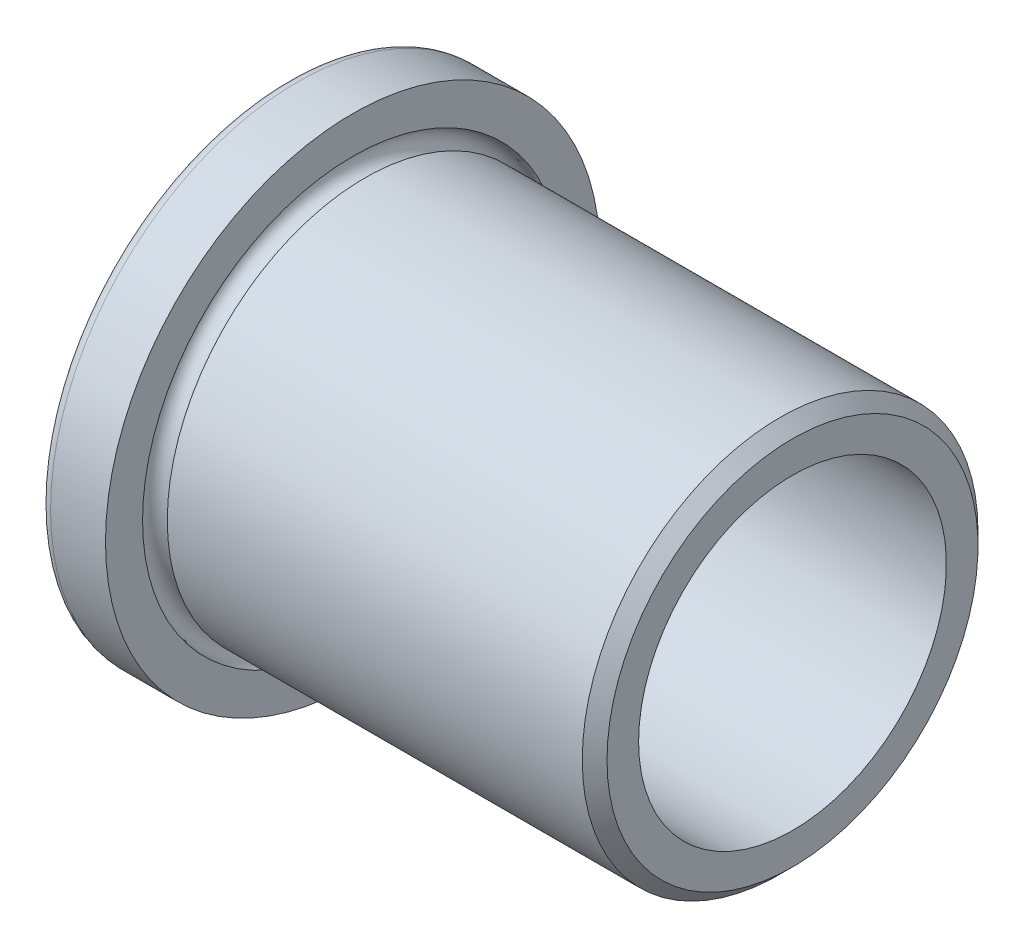
ISO-10303-21;
HEADER;
FILE_DESCRIPTION(('STEP AP214'),'2;1');
FILE_NAME('part.step','',(''),(''),'','','');
FILE_SCHEMA(('AUTOMOTIVE_DESIGN { 1 0 10303 214 1 1 1 1 }'));
ENDSEC;
DATA;
#1=APPLICATION_CONTEXT('core data for automotive mechanical design processes');
#2=APPLICATION_PROTOCOL_DEFINITION('international standard','automotive_design',2000,#1);
#3=PRODUCT_CONTEXT('',#1,'mechanical');
#4=PRODUCT('Part','Part','',(#3));
#5=PRODUCT_RELATED_PRODUCT_CATEGORY('part','',(#4));
#6=PRODUCT_DEFINITION_FORMATION('','',#4);
#7=PRODUCT_DEFINITION_CONTEXT('part definition',#1,'design');
#8=PRODUCT_DEFINITION('design','',#6,#7);
#9=PRODUCT_DEFINITION_SHAPE('','',#8);
#10=(LENGTH_UNIT() NAMED_UNIT(*) SI_UNIT(.MILLI.,.METRE.));
#11=(NAMED_UNIT(*) PLANE_ANGLE_UNIT() SI_UNIT($,.RADIAN.));
#12=(NAMED_UNIT(*) SI_UNIT($,.STERADIAN.) SOLID_ANGLE_UNIT());
#13=UNCERTAINTY_MEASURE_WITH_UNIT(LENGTH_MEASURE(1.E-05),#10,'distance_accuracy_value','');
#14=(GEOMETRIC_REPRESENTATION_CONTEXT(3) GLOBAL_UNCERTAINTY_ASSIGNED_CONTEXT((#13)) GLOBAL_UNIT_ASSIGNED_CONTEXT((#10,
#11,#12)) REPRESENTATION_CONTEXT('',''));
#15=CARTESIAN_POINT('',(0.,0.,0.));
#16=DIRECTION('',(0.,0.,1.));
#17=DIRECTION('',(1.,0.,0.));
#18=AXIS2_PLACEMENT_3D('',#15,#16,#17);
#19=CARTESIAN_POINT('',(9.525,35.7124,0.));
#20=DIRECTION('',(1.,0.,0.));
#21=DIRECTION('',(0.,0.,-1.));
#22=AXIS2_PLACEMENT_3D('',#19,#20,#21);
#23=PLANE('',#22);
#24=CARTESIAN_POINT('',(9.525,0.,0.));
#25=DIRECTION('',(-1.,0.,0.));
#26=DIRECTION('',(0.,0.,1.));
#27=AXIS2_PLACEMENT_3D('',#24,#25,#26);
#28=CIRCLE('',#27,30.35935);
#29=CARTESIAN_POINT('',(9.525,0.,30.35935));
#30=VERTEX_POINT('',#29);
#31=EDGE_CURVE('E64',#30,#30,#28,.T.);
#32=ORIENTED_EDGE('',*,*,#31,.T.);
#33=EDGE_LOOP('',(#32));
#34=FACE_BOUND('',#33,.T.);
#35=CARTESIAN_POINT('',(9.525,0.,0.));
#36=DIRECTION('',(-1.,0.,0.));
#37=DIRECTION('',(0.,0.,1.));
#38=AXIS2_PLACEMENT_3D('',#35,#36,#37);
#39=CIRCLE('',#38,35.7124);
#40=CARTESIAN_POINT('',(9.525,0.,35.7124));
#41=VERTEX_POINT('',#40);
#42=EDGE_CURVE('E10',#41,#41,#39,.T.);
#43=ORIENTED_EDGE('',*,*,#42,.F.);
#44=EDGE_LOOP('',(#43));
#45=FACE_BOUND('',#44,.T.);
#46=ADVANCED_FACE('F30',(#34,#45),#23,.T.);
#47=CARTESIAN_POINT('',(0.,0.,0.));
#48=DIRECTION('',(-1.,0.,0.));
#49=DIRECTION('',(0.,0.,1.));
#50=AXIS2_PLACEMENT_3D('',#47,#48,#49);
#51=CYLINDRICAL_SURFACE('',#50,35.7124);
#52=ORIENTED_EDGE('',*,*,#42,.T.);
#53=EDGE_LOOP('',(#52));
#54=FACE_BOUND('',#53,.T.);
#55=CARTESIAN_POINT('',(1.5875,0.,0.));
#56=DIRECTION('',(-1.,0.,0.));
#57=DIRECTION('',(0.,0.,1.));
#58=AXIS2_PLACEMENT_3D('',#55,#56,#57);
#59=CIRCLE('',#58,35.7124);
#60=CARTESIAN_POINT('',(1.5875,0.,35.7124));
#61=VERTEX_POINT('',#60);
#62=EDGE_CURVE('E36',#61,#61,#59,.T.);
#63=ORIENTED_EDGE('',*,*,#62,.F.);
#64=EDGE_LOOP('',(#63));
#65=FACE_BOUND('',#64,.T.);
#66=ADVANCED_FACE('F82',(#54,#65),#51,.T.);
#67=CARTESIAN_POINT('',(1.5875,0.,0.));
#68=DIRECTION('',(-1.,0.,0.));
#69=DIRECTION('',(0.,0.,1.));
#70=AXIS2_PLACEMENT_3D('',#67,#68,#69);
#71=TOROIDAL_SURFACE('',#70,34.1249,1.5875);
#72=CARTESIAN_POINT('',(0.,0.,0.));
#73=DIRECTION('',(-1.,0.,0.));
#74=DIRECTION('',(0.,0.,1.));
#75=AXIS2_PLACEMENT_3D('',#72,#73,#74);
#76=CIRCLE('',#75,34.1249);
#77=CARTESIAN_POINT('',(0.,0.,34.1249));
#78=VERTEX_POINT('',#77);
#79=EDGE_CURVE('E40',#78,#78,#76,.T.);
#80=ORIENTED_EDGE('',*,*,#79,.F.);
#81=EDGE_LOOP('',(#80));
#82=FACE_BOUND('',#81,.T.);
#83=ORIENTED_EDGE('',*,*,#62,.T.);
#84=EDGE_LOOP('',(#83));
#85=FACE_BOUND('',#84,.T.);
#86=ADVANCED_FACE('F86',(#82,#85),#71,.T.);
#87=CARTESIAN_POINT('',(0.,25.4,0.));
#88=DIRECTION('',(-1.,0.,0.));
#89=DIRECTION('',(0.,0.,1.));
#90=AXIS2_PLACEMENT_3D('',#87,#88,#89);
#91=PLANE('',#90);
#92=ORIENTED_EDGE('',*,*,#79,.T.);
#93=EDGE_LOOP('',(#92));
#94=FACE_BOUND('',#93,.T.);
#95=CARTESIAN_POINT('',(0.,0.,0.));
#96=DIRECTION('',(-1.,0.,0.));
#97=DIRECTION('',(0.,0.,1.));
#98=AXIS2_PLACEMENT_3D('',#95,#96,#97);
#99=CIRCLE('',#98,25.4);
#100=CARTESIAN_POINT('',(0.,0.,25.4));
#101=VERTEX_POINT('',#100);
#102=EDGE_CURVE('E44',#101,#101,#99,.T.);
#103=ORIENTED_EDGE('',*,*,#102,.F.);
#104=EDGE_LOOP('',(#103));
#105=FACE_BOUND('',#104,.T.);
#106=ADVANCED_FACE('F90',(#94,#105),#91,.T.);
#107=CARTESIAN_POINT('',(3.175,0.,0.));
#108=DIRECTION('',(-1.,0.,0.));
#109=DIRECTION('',(0.,0.,1.));
#110=AXIS2_PLACEMENT_3D('',#107,#108,#109);
#111=TOROIDAL_SURFACE('',#110,25.4,3.175);
#112=CARTESIAN_POINT('',(3.175,0.,0.));
#113=DIRECTION('',(-1.,0.,0.));
#114=DIRECTION('',(0.,0.,1.));
#115=AXIS2_PLACEMENT_3D('',#112,#113,#114);
#116=CIRCLE('',#115,22.225);
#117=CARTESIAN_POINT('',(3.175,0.,22.225));
#118=VERTEX_POINT('',#117);
#119=EDGE_CURVE('E49',#118,#118,#116,.T.);
#120=ORIENTED_EDGE('',*,*,#119,.F.);
#121=EDGE_LOOP('',(#120));
#122=FACE_BOUND('',#121,.T.);
#123=ORIENTED_EDGE('',*,*,#102,.T.);
#124=EDGE_LOOP('',(#123));
#125=FACE_BOUND('',#124,.T.);
#126=ADVANCED_FACE('F97',(#122,#125),#111,.T.);
#127=CARTESIAN_POINT('',(0.,0.,0.));
#128=DIRECTION('',(-1.,0.,0.));
#129=DIRECTION('',(0.,0.,1.));
#130=AXIS2_PLACEMENT_3D('',#127,#128,#129);
#131=CYLINDRICAL_SURFACE('',#130,22.225);
#132=ORIENTED_EDGE('',*,*,#119,.T.);
#133=EDGE_LOOP('',(#132));
#134=FACE_BOUND('',#133,.T.);
#135=CARTESIAN_POINT('',(73.025,0.,0.));
#136=DIRECTION('',(-1.,0.,0.));
#137=DIRECTION('',(0.,0.,1.));
#138=AXIS2_PLACEMENT_3D('',#135,#136,#137);
#139=CIRCLE('',#138,22.225);
#140=CARTESIAN_POINT('',(73.025,0.,22.225));
#141=VERTEX_POINT('',#140);
#142=EDGE_CURVE('E52',#141,#141,#139,.T.);
#143=ORIENTED_EDGE('',*,*,#142,.F.);
#144=EDGE_LOOP('',(#143));
#145=FACE_BOUND('',#144,.T.);
#146=ADVANCED_FACE('F101',(#134,#145),#131,.F.);
#147=CARTESIAN_POINT('',(73.025,26.7890625,0.));
#148=DIRECTION('',(1.,0.,0.));
#149=DIRECTION('',(0.,0.,-1.));
#150=AXIS2_PLACEMENT_3D('',#147,#148,#149);
#151=PLANE('',#150);
#152=ORIENTED_EDGE('',*,*,#142,.T.);
#153=EDGE_LOOP('',(#152));
#154=FACE_BOUND('',#153,.T.);
#155=CARTESIAN_POINT('',(73.025,0.,0.));
#156=DIRECTION('',(-1.,0.,0.));
#157=DIRECTION('',(0.,0.,1.));
#158=AXIS2_PLACEMENT_3D('',#155,#156,#157);
#159=CIRCLE('',#158,26.7890625);
#160=CARTESIAN_POINT('',(73.025,0.,26.7890625));
#161=VERTEX_POINT('',#160);
#162=EDGE_CURVE('E55',#161,#161,#159,.T.);
#163=ORIENTED_EDGE('',*,*,#162,.F.);
#164=EDGE_LOOP('',(#163));
#165=FACE_BOUND('',#164,.T.);
#166=ADVANCED_FACE('F105',(#154,#165),#151,.T.);
#167=CARTESIAN_POINT('',(71.2390625,0.,0.));
#168=DIRECTION('',(-1.,0.,0.));
#169=DIRECTION('',(0.,0.,1.));
#170=AXIS2_PLACEMENT_3D('',#167,#168,#169);
#171=CONICAL_SURFACE('',#170,28.575,0.785398163397446);
#172=ORIENTED_EDGE('',*,*,#162,.T.);
#173=EDGE_LOOP('',(#172));
#174=FACE_BOUND('',#173,.T.);
#175=CARTESIAN_POINT('',(71.2390625,0.,0.));
#176=DIRECTION('',(-1.,0.,0.));
#177=DIRECTION('',(0.,0.,1.));
#178=AXIS2_PLACEMENT_3D('',#175,#176,#177);
#179=CIRCLE('',#178,28.575);
#180=CARTESIAN_POINT('',(71.2390625,0.,28.575));
#181=VERTEX_POINT('',#180);
#182=EDGE_CURVE('E58',#181,#181,#179,.T.);
#183=ORIENTED_EDGE('',*,*,#182,.F.);
#184=EDGE_LOOP('',(#183));
#185=FACE_BOUND('',#184,.T.);
#186=ADVANCED_FACE('F78',(#174,#185),#171,.T.);
#187=CARTESIAN_POINT('',(0.,0.,0.));
#188=DIRECTION('',(-1.,0.,0.));
#189=DIRECTION('',(0.,0.,1.));
#190=AXIS2_PLACEMENT_3D('',#187,#188,#189);
#191=CYLINDRICAL_SURFACE('',#190,28.575);
#192=ORIENTED_EDGE('',*,*,#182,.T.);
#193=EDGE_LOOP('',(#192));
#194=FACE_BOUND('',#193,.T.);
#195=CARTESIAN_POINT('',(11.30935,0.,0.));
#196=DIRECTION('',(-1.,0.,0.));
#197=DIRECTION('',(0.,0.,1.));
#198=AXIS2_PLACEMENT_3D('',#195,#196,#197);
#199=CIRCLE('',#198,28.575);
#200=CARTESIAN_POINT('',(11.30935,0.,28.575));
#201=VERTEX_POINT('',#200);
#202=EDGE_CURVE('E61',#201,#201,#199,.T.);
#203=ORIENTED_EDGE('',*,*,#202,.F.);
#204=EDGE_LOOP('',(#203));
#205=FACE_BOUND('',#204,.T.);
#206=ADVANCED_FACE('F72',(#194,#205),#191,.T.);
#207=CARTESIAN_POINT('',(9.525,0.,0.));
#208=DIRECTION('',(-1.,0.,0.));
#209=DIRECTION('',(0.,0.,1.));
#210=AXIS2_PLACEMENT_3D('',#207,#208,#209);
#211=TOROIDAL_SURFACE('',#210,28.575,1.78435);
#212=ORIENTED_EDGE('',*,*,#202,.T.);
#213=EDGE_LOOP('',(#212));
#214=FACE_BOUND('',#213,.T.);
#215=ORIENTED_EDGE('',*,*,#31,.F.);
#216=EDGE_LOOP('',(#215));
#217=FACE_BOUND('',#216,.T.);
#218=ADVANCED_FACE('F70',(#214,#217),#211,.F.);
#219=CLOSED_SHELL('',(#46,#66,#86,#106,#126,#146,#166,#186,#206,#218));
#220=MANIFOLD_SOLID_BREP('B2',#219);
#221=ADVANCED_BREP_SHAPE_REPRESENTATION('',(#18,#220),#14);
#222=SHAPE_DEFINITION_REPRESENTATION(#9,#221);
ENDSEC;
END-ISO-10303-21;
